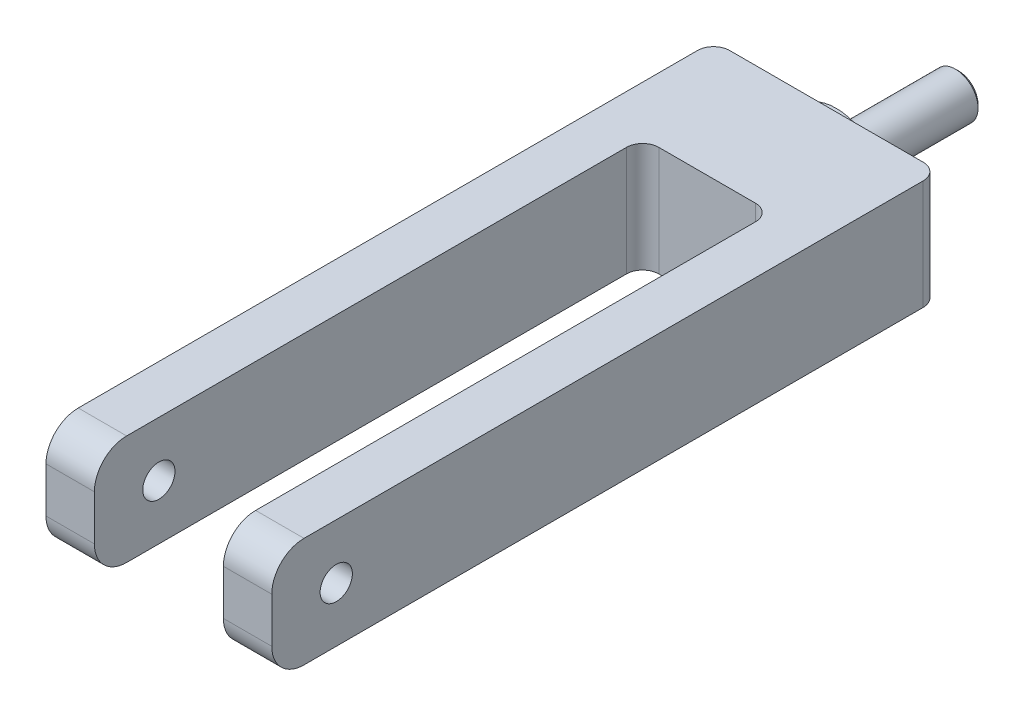
ISO-10303-21;
HEADER;
FILE_DESCRIPTION(('STEP AP214'),'2;1');
FILE_NAME('part.step','',(''),(''),'','','');
FILE_SCHEMA(('AUTOMOTIVE_DESIGN { 1 0 10303 214 1 1 1 1 }'));
ENDSEC;
DATA;
#1=APPLICATION_CONTEXT('core data for automotive mechanical design processes');
#2=APPLICATION_PROTOCOL_DEFINITION('international standard','automotive_design',2000,#1);
#3=PRODUCT_CONTEXT('',#1,'mechanical');
#4=PRODUCT('Part','Part','',(#3));
#5=PRODUCT_RELATED_PRODUCT_CATEGORY('part','',(#4));
#6=PRODUCT_DEFINITION_FORMATION('','',#4);
#7=PRODUCT_DEFINITION_CONTEXT('part definition',#1,'design');
#8=PRODUCT_DEFINITION('design','',#6,#7);
#9=PRODUCT_DEFINITION_SHAPE('','',#8);
#10=(LENGTH_UNIT() NAMED_UNIT(*) SI_UNIT(.MILLI.,.METRE.));
#11=(NAMED_UNIT(*) PLANE_ANGLE_UNIT() SI_UNIT($,.RADIAN.));
#12=(NAMED_UNIT(*) SI_UNIT($,.STERADIAN.) SOLID_ANGLE_UNIT());
#13=UNCERTAINTY_MEASURE_WITH_UNIT(LENGTH_MEASURE(1.E-05),#10,'distance_accuracy_value','');
#14=(GEOMETRIC_REPRESENTATION_CONTEXT(3) GLOBAL_UNCERTAINTY_ASSIGNED_CONTEXT((#13)) GLOBAL_UNIT_ASSIGNED_CONTEXT((#10,
#11,#12)) REPRESENTATION_CONTEXT('',''));
#15=CARTESIAN_POINT('',(0.,0.,0.));
#16=DIRECTION('',(0.,0.,1.));
#17=DIRECTION('',(1.,0.,0.));
#18=AXIS2_PLACEMENT_3D('',#15,#16,#17);
#19=CARTESIAN_POINT('',(0.,0.,-122.906328320802));
#20=DIRECTION('',(0.,0.,-1.));
#21=DIRECTION('',(-1.,0.,0.));
#22=AXIS2_PLACEMENT_3D('',#19,#20,#21);
#23=PLANE('',#22);
#24=CARTESIAN_POINT('',(0.,0.,-122.906328320802));
#25=DIRECTION('',(0.,0.,-1.));
#26=DIRECTION('',(-1.,0.,0.));
#27=AXIS2_PLACEMENT_3D('',#24,#25,#26);
#28=CIRCLE('',#27,15.);
#29=CARTESIAN_POINT('',(-15.,0.,-122.906328320802));
#30=VERTEX_POINT('',#29);
#31=EDGE_CURVE('E393',#30,#30,#28,.T.);
#32=ORIENTED_EDGE('',*,*,#31,.T.);
#33=EDGE_LOOP('',(#32));
#34=FACE_BOUND('',#33,.T.);
#35=CARTESIAN_POINT('',(0.,0.,-122.906328320802));
#36=DIRECTION('',(0.,0.,-1.));
#37=DIRECTION('',(-1.,0.,0.));
#38=AXIS2_PLACEMENT_3D('',#35,#36,#37);
#39=CIRCLE('',#38,7.);
#40=CARTESIAN_POINT('',(-7.00000000000002,0.,-122.906328320802));
#41=VERTEX_POINT('',#40);
#42=EDGE_CURVE('E250',#41,#41,#39,.T.);
#43=ORIENTED_EDGE('',*,*,#42,.F.);
#44=EDGE_LOOP('',(#43));
#45=FACE_BOUND('',#44,.T.);
#46=ADVANCED_FACE('F43',(#34,#45),#23,.T.);
#47=CARTESIAN_POINT('',(-35.,17.,-119.906328320802));
#48=DIRECTION('',(0.,0.,1.));
#49=DIRECTION('',(1.,0.,0.));
#50=AXIS2_PLACEMENT_3D('',#47,#48,#49);
#51=PLANE('',#50);
#52=DIRECTION('',(-1.,0.,0.));
#53=VECTOR('',#52,1.);
#54=CARTESIAN_POINT('',(-35.,17.,-119.906328320802));
#55=LINE('',#54,#53);
#56=CARTESIAN_POINT('',(30.,17.,-119.906328320802));
#57=VERTEX_POINT('',#56);
#58=CARTESIAN_POINT('',(-30.,17.,-119.906328320802));
#59=VERTEX_POINT('',#58);
#60=EDGE_CURVE('E203',#57,#59,#55,.T.);
#61=ORIENTED_EDGE('',*,*,#60,.F.);
#62=DIRECTION('',(0.,-1.,0.));
#63=VECTOR('',#62,1.);
#64=CARTESIAN_POINT('',(30.,17.,-119.906328320802));
#65=LINE('',#64,#63);
#66=CARTESIAN_POINT('',(30.,-17.,-119.906328320802));
#67=VERTEX_POINT('',#66);
#68=EDGE_CURVE('E219',#57,#67,#65,.T.);
#69=ORIENTED_EDGE('',*,*,#68,.T.);
#70=DIRECTION('',(-1.,0.,0.));
#71=VECTOR('',#70,1.);
#72=CARTESIAN_POINT('',(-35.,-17.,-119.906328320802));
#73=LINE('',#72,#71);
#74=CARTESIAN_POINT('',(-30.,-17.,-119.906328320802));
#75=VERTEX_POINT('',#74);
#76=EDGE_CURVE('E190',#67,#75,#73,.T.);
#77=ORIENTED_EDGE('',*,*,#76,.T.);
#78=DIRECTION('',(0.,-1.,0.));
#79=VECTOR('',#78,1.);
#80=CARTESIAN_POINT('',(-30.,17.,-119.906328320802));
#81=LINE('',#80,#79);
#82=EDGE_CURVE('E217',#75,#59,#81,.F.);
#83=ORIENTED_EDGE('',*,*,#82,.T.);
#84=EDGE_LOOP('',(#61,#69,#77,#83));
#85=FACE_BOUND('',#84,.T.);
#86=CARTESIAN_POINT('',(0.,0.,-119.906328320802));
#87=DIRECTION('',(0.,0.,1.));
#88=DIRECTION('',(1.,0.,0.));
#89=AXIS2_PLACEMENT_3D('',#86,#87,#88);
#90=CIRCLE('',#89,15.);
#91=CARTESIAN_POINT('',(15.,0.,-119.906328320802));
#92=VERTEX_POINT('',#91);
#93=EDGE_CURVE('E242',#92,#92,#90,.F.);
#94=ORIENTED_EDGE('',*,*,#93,.F.);
#95=EDGE_LOOP('',(#94));
#96=FACE_BOUND('',#95,.T.);
#97=ADVANCED_FACE('F296',(#85,#96),#51,.F.);
#98=CARTESIAN_POINT('',(-35.,17.,-119.906328320802));
#99=DIRECTION('',(1.,0.,0.));
#100=DIRECTION('',(0.,0.,-1.));
#101=AXIS2_PLACEMENT_3D('',#98,#99,#100);
#102=PLANE('',#101);
#103=CARTESIAN_POINT('',(-35.,0.,67.093671679198));
#104=DIRECTION('',(1.,0.,0.));
#105=DIRECTION('',(0.,0.,-1.));
#106=AXIS2_PLACEMENT_3D('',#103,#104,#105);
#107=CIRCLE('',#106,5.);
#108=CARTESIAN_POINT('',(-35.,0.,62.093671679198));
#109=VERTEX_POINT('',#108);
#110=EDGE_CURVE('E420',#109,#109,#107,.T.);
#111=ORIENTED_EDGE('',*,*,#110,.T.);
#112=EDGE_LOOP('',(#111));
#113=FACE_BOUND('',#112,.T.);
#114=DIRECTION('',(0.,0.,1.));
#115=VECTOR('',#114,1.);
#116=CARTESIAN_POINT('',(-35.,-17.,-119.906328320802));
#117=LINE('',#116,#115);
#118=CARTESIAN_POINT('',(-35.,-17.,-114.906328320802));
#119=VERTEX_POINT('',#118);
#120=CARTESIAN_POINT('',(-35.,-17.,77.093671679198));
#121=VERTEX_POINT('',#120);
#122=EDGE_CURVE('E391',#119,#121,#117,.T.);
#123=ORIENTED_EDGE('',*,*,#122,.T.);
#124=CARTESIAN_POINT('',(-35.,-7.,77.093671679198));
#125=DIRECTION('',(1.,0.,0.));
#126=DIRECTION('',(0.,0.,-1.));
#127=AXIS2_PLACEMENT_3D('',#124,#125,#126);
#128=CIRCLE('',#127,10.);
#129=CARTESIAN_POINT('',(-35.,-7.,87.093671679198));
#130=VERTEX_POINT('',#129);
#131=EDGE_CURVE('E275',#121,#130,#128,.F.);
#132=ORIENTED_EDGE('',*,*,#131,.T.);
#133=DIRECTION('',(0.,-1.,0.));
#134=VECTOR('',#133,1.);
#135=CARTESIAN_POINT('',(-35.,17.,87.093671679198));
#136=LINE('',#135,#134);
#137=CARTESIAN_POINT('',(-35.,7.,87.093671679198));
#138=VERTEX_POINT('',#137);
#139=EDGE_CURVE('E181',#138,#130,#136,.T.);
#140=ORIENTED_EDGE('',*,*,#139,.F.);
#141=CARTESIAN_POINT('',(-35.,7.,77.093671679198));
#142=DIRECTION('',(1.,0.,0.));
#143=DIRECTION('',(0.,0.,-1.));
#144=AXIS2_PLACEMENT_3D('',#141,#142,#143);
#145=CIRCLE('',#144,10.);
#146=CARTESIAN_POINT('',(-35.,17.,77.093671679198));
#147=VERTEX_POINT('',#146);
#148=EDGE_CURVE('E58',#138,#147,#145,.F.);
#149=ORIENTED_EDGE('',*,*,#148,.T.);
#150=DIRECTION('',(0.,0.,1.));
#151=VECTOR('',#150,1.);
#152=CARTESIAN_POINT('',(-35.,17.,-119.906328320802));
#153=LINE('',#152,#151);
#154=CARTESIAN_POINT('',(-35.,17.,-114.906328320802));
#155=VERTEX_POINT('',#154);
#156=EDGE_CURVE('E198',#155,#147,#153,.T.);
#157=ORIENTED_EDGE('',*,*,#156,.F.);
#158=DIRECTION('',(0.,-1.,0.));
#159=VECTOR('',#158,1.);
#160=CARTESIAN_POINT('',(-35.,17.,-114.906328320802));
#161=LINE('',#160,#159);
#162=EDGE_CURVE('E170',#155,#119,#161,.T.);
#163=ORIENTED_EDGE('',*,*,#162,.T.);
#164=EDGE_LOOP('',(#123,#132,#140,#149,#157,#163));
#165=FACE_BOUND('',#164,.T.);
#166=ADVANCED_FACE('F302',(#113,#165),#102,.F.);
#167=CARTESIAN_POINT('',(-35.,17.,87.093671679198));
#168=DIRECTION('',(0.,0.,-1.));
#169=DIRECTION('',(-1.,0.,0.));
#170=AXIS2_PLACEMENT_3D('',#167,#168,#169);
#171=PLANE('',#170);
#172=ORIENTED_EDGE('',*,*,#139,.T.);
#173=DIRECTION('',(1.,0.,0.));
#174=VECTOR('',#173,1.);
#175=CARTESIAN_POINT('',(-35.,-7.,87.093671679198));
#176=LINE('',#175,#174);
#177=CARTESIAN_POINT('',(-20.,-7.,87.093671679198));
#178=VERTEX_POINT('',#177);
#179=EDGE_CURVE('E268',#130,#178,#176,.T.);
#180=ORIENTED_EDGE('',*,*,#179,.T.);
#181=DIRECTION('',(0.,-1.,0.));
#182=VECTOR('',#181,1.);
#183=CARTESIAN_POINT('',(-20.,17.,87.093671679198));
#184=LINE('',#183,#182);
#185=CARTESIAN_POINT('',(-20.,7.,87.093671679198));
#186=VERTEX_POINT('',#185);
#187=EDGE_CURVE('E206',#186,#178,#184,.T.);
#188=ORIENTED_EDGE('',*,*,#187,.F.);
#189=DIRECTION('',(1.,0.,0.));
#190=VECTOR('',#189,1.);
#191=CARTESIAN_POINT('',(-35.,7.,87.093671679198));
#192=LINE('',#191,#190);
#193=EDGE_CURVE('E266',#186,#138,#192,.F.);
#194=ORIENTED_EDGE('',*,*,#193,.T.);
#195=EDGE_LOOP('',(#172,#180,#188,#194));
#196=FACE_BOUND('',#195,.T.);
#197=ADVANCED_FACE('F341',(#196),#171,.F.);
#198=CARTESIAN_POINT('',(-20.,17.,-82.906328320802));
#199=DIRECTION('',(-1.,0.,0.));
#200=DIRECTION('',(0.,0.,1.));
#201=AXIS2_PLACEMENT_3D('',#198,#199,#200);
#202=PLANE('',#201);
#203=CARTESIAN_POINT('',(-20.,0.,67.093671679198));
#204=DIRECTION('',(-1.,0.,0.));
#205=DIRECTION('',(0.,0.,1.));
#206=AXIS2_PLACEMENT_3D('',#203,#204,#205);
#207=CIRCLE('',#206,5.);
#208=CARTESIAN_POINT('',(-20.,0.,72.093671679198));
#209=VERTEX_POINT('',#208);
#210=EDGE_CURVE('E423',#209,#209,#207,.T.);
#211=ORIENTED_EDGE('',*,*,#210,.T.);
#212=EDGE_LOOP('',(#211));
#213=FACE_BOUND('',#212,.T.);
#214=ORIENTED_EDGE('',*,*,#187,.T.);
#215=CARTESIAN_POINT('',(-20.,-7.,77.093671679198));
#216=DIRECTION('',(-1.,0.,0.));
#217=DIRECTION('',(0.,0.,1.));
#218=AXIS2_PLACEMENT_3D('',#215,#216,#217);
#219=CIRCLE('',#218,10.);
#220=CARTESIAN_POINT('',(-20.,-17.,77.093671679198));
#221=VERTEX_POINT('',#220);
#222=EDGE_CURVE('E272',#178,#221,#219,.F.);
#223=ORIENTED_EDGE('',*,*,#222,.T.);
#224=DIRECTION('',(0.,0.,-1.));
#225=VECTOR('',#224,1.);
#226=CARTESIAN_POINT('',(-20.,-17.,-82.906328320802));
#227=LINE('',#226,#225);
#228=CARTESIAN_POINT('',(-20.,-17.,-77.906328320802));
#229=VERTEX_POINT('',#228);
#230=EDGE_CURVE('E192',#221,#229,#227,.T.);
#231=ORIENTED_EDGE('',*,*,#230,.T.);
#232=DIRECTION('',(0.,-1.,0.));
#233=VECTOR('',#232,1.);
#234=CARTESIAN_POINT('',(-20.,17.,-77.906328320802));
#235=LINE('',#234,#233);
#236=CARTESIAN_POINT('',(-20.,17.,-77.906328320802));
#237=VERTEX_POINT('',#236);
#238=EDGE_CURVE('E214',#229,#237,#235,.F.);
#239=ORIENTED_EDGE('',*,*,#238,.T.);
#240=DIRECTION('',(0.,0.,-1.));
#241=VECTOR('',#240,1.);
#242=CARTESIAN_POINT('',(-20.,17.,-82.906328320802));
#243=LINE('',#242,#241);
#244=CARTESIAN_POINT('',(-20.,17.,77.093671679198));
#245=VERTEX_POINT('',#244);
#246=EDGE_CURVE('E374',#245,#237,#243,.T.);
#247=ORIENTED_EDGE('',*,*,#246,.F.);
#248=CARTESIAN_POINT('',(-20.,7.,77.093671679198));
#249=DIRECTION('',(-1.,0.,0.));
#250=DIRECTION('',(0.,0.,1.));
#251=AXIS2_PLACEMENT_3D('',#248,#249,#250);
#252=CIRCLE('',#251,10.);
#253=EDGE_CURVE('E66',#245,#186,#252,.F.);
#254=ORIENTED_EDGE('',*,*,#253,.T.);
#255=EDGE_LOOP('',(#214,#223,#231,#239,#247,#254));
#256=FACE_BOUND('',#255,.T.);
#257=ADVANCED_FACE('F337',(#213,#256),#202,.F.);
#258=CARTESIAN_POINT('',(-20.,17.,-82.906328320802));
#259=DIRECTION('',(0.,0.,-1.));
#260=DIRECTION('',(-1.,0.,0.));
#261=AXIS2_PLACEMENT_3D('',#258,#259,#260);
#262=PLANE('',#261);
#263=DIRECTION('',(1.,0.,0.));
#264=VECTOR('',#263,1.);
#265=CARTESIAN_POINT('',(-20.,-17.,-82.906328320802));
#266=LINE('',#265,#264);
#267=CARTESIAN_POINT('',(-15.,-17.,-82.906328320802));
#268=VERTEX_POINT('',#267);
#269=CARTESIAN_POINT('',(15.,-17.,-82.906328320802));
#270=VERTEX_POINT('',#269);
#271=EDGE_CURVE('E188',#268,#270,#266,.T.);
#272=ORIENTED_EDGE('',*,*,#271,.T.);
#273=DIRECTION('',(0.,-1.,0.));
#274=VECTOR('',#273,1.);
#275=CARTESIAN_POINT('',(15.,17.,-82.906328320802));
#276=LINE('',#275,#274);
#277=CARTESIAN_POINT('',(15.,17.,-82.906328320802));
#278=VERTEX_POINT('',#277);
#279=EDGE_CURVE('E164',#270,#278,#276,.F.);
#280=ORIENTED_EDGE('',*,*,#279,.T.);
#281=DIRECTION('',(1.,0.,0.));
#282=VECTOR('',#281,1.);
#283=CARTESIAN_POINT('',(-20.,17.,-82.906328320802));
#284=LINE('',#283,#282);
#285=CARTESIAN_POINT('',(-15.,17.,-82.906328320802));
#286=VERTEX_POINT('',#285);
#287=EDGE_CURVE('E379',#286,#278,#284,.T.);
#288=ORIENTED_EDGE('',*,*,#287,.F.);
#289=DIRECTION('',(0.,-1.,0.));
#290=VECTOR('',#289,1.);
#291=CARTESIAN_POINT('',(-15.,-17.,-82.906328320802));
#292=LINE('',#291,#290);
#293=EDGE_CURVE('E180',#286,#268,#292,.T.);
#294=ORIENTED_EDGE('',*,*,#293,.T.);
#295=EDGE_LOOP('',(#272,#280,#288,#294));
#296=FACE_BOUND('',#295,.T.);
#297=ADVANCED_FACE('F333',(#296),#262,.F.);
#298=CARTESIAN_POINT('',(20.,17.,-82.906328320802));
#299=DIRECTION('',(1.,0.,0.));
#300=DIRECTION('',(0.,0.,-1.));
#301=AXIS2_PLACEMENT_3D('',#298,#299,#300);
#302=PLANE('',#301);
#303=CARTESIAN_POINT('',(20.,0.,67.093671679198));
#304=DIRECTION('',(1.,0.,0.));
#305=DIRECTION('',(0.,0.,-1.));
#306=AXIS2_PLACEMENT_3D('',#303,#304,#305);
#307=CIRCLE('',#306,5.);
#308=CARTESIAN_POINT('',(20.,0.,62.093671679198));
#309=VERTEX_POINT('',#308);
#310=EDGE_CURVE('E249',#309,#309,#307,.T.);
#311=ORIENTED_EDGE('',*,*,#310,.T.);
#312=EDGE_LOOP('',(#311));
#313=FACE_BOUND('',#312,.T.);
#314=DIRECTION('',(0.,0.,1.));
#315=VECTOR('',#314,1.);
#316=CARTESIAN_POINT('',(20.,-17.,-82.906328320802));
#317=LINE('',#316,#315);
#318=CARTESIAN_POINT('',(20.,-17.,-77.906328320802));
#319=VERTEX_POINT('',#318);
#320=CARTESIAN_POINT('',(20.,-17.,77.093671679198));
#321=VERTEX_POINT('',#320);
#322=EDGE_CURVE('E176',#319,#321,#317,.T.);
#323=ORIENTED_EDGE('',*,*,#322,.T.);
#324=CARTESIAN_POINT('',(20.,-7.,77.093671679198));
#325=DIRECTION('',(1.,0.,0.));
#326=DIRECTION('',(0.,0.,-1.));
#327=AXIS2_PLACEMENT_3D('',#324,#325,#326);
#328=CIRCLE('',#327,10.);
#329=CARTESIAN_POINT('',(20.,-7.,87.093671679198));
#330=VERTEX_POINT('',#329);
#331=EDGE_CURVE('E264',#321,#330,#328,.F.);
#332=ORIENTED_EDGE('',*,*,#331,.T.);
#333=DIRECTION('',(0.,-1.,0.));
#334=VECTOR('',#333,1.);
#335=CARTESIAN_POINT('',(20.,17.,87.093671679198));
#336=LINE('',#335,#334);
#337=CARTESIAN_POINT('',(20.,7.,87.093671679198));
#338=VERTEX_POINT('',#337);
#339=EDGE_CURVE('E202',#338,#330,#336,.T.);
#340=ORIENTED_EDGE('',*,*,#339,.F.);
#341=CARTESIAN_POINT('',(20.,7.,77.093671679198));
#342=DIRECTION('',(1.,0.,0.));
#343=DIRECTION('',(0.,0.,-1.));
#344=AXIS2_PLACEMENT_3D('',#341,#342,#343);
#345=CIRCLE('',#344,10.);
#346=CARTESIAN_POINT('',(20.,17.,77.093671679198));
#347=VERTEX_POINT('',#346);
#348=EDGE_CURVE('E262',#338,#347,#345,.F.);
#349=ORIENTED_EDGE('',*,*,#348,.T.);
#350=DIRECTION('',(0.,0.,1.));
#351=VECTOR('',#350,1.);
#352=CARTESIAN_POINT('',(20.,17.,-82.906328320802));
#353=LINE('',#352,#351);
#354=CARTESIAN_POINT('',(20.,17.,-77.906328320802));
#355=VERTEX_POINT('',#354);
#356=EDGE_CURVE('E179',#355,#347,#353,.T.);
#357=ORIENTED_EDGE('',*,*,#356,.F.);
#358=DIRECTION('',(0.,-1.,0.));
#359=VECTOR('',#358,1.);
#360=CARTESIAN_POINT('',(20.,-17.,-77.906328320802));
#361=LINE('',#360,#359);
#362=EDGE_CURVE('E163',#355,#319,#361,.T.);
#363=ORIENTED_EDGE('',*,*,#362,.T.);
#364=EDGE_LOOP('',(#323,#332,#340,#349,#357,#363));
#365=FACE_BOUND('',#364,.T.);
#366=ADVANCED_FACE('F175',(#313,#365),#302,.F.);
#367=CARTESIAN_POINT('',(20.,17.,87.093671679198));
#368=DIRECTION('',(0.,0.,-1.));
#369=DIRECTION('',(-1.,0.,0.));
#370=AXIS2_PLACEMENT_3D('',#367,#368,#369);
#371=PLANE('',#370);
#372=ORIENTED_EDGE('',*,*,#339,.T.);
#373=DIRECTION('',(1.,0.,0.));
#374=VECTOR('',#373,1.);
#375=CARTESIAN_POINT('',(20.,-7.,87.093671679198));
#376=LINE('',#375,#374);
#377=CARTESIAN_POINT('',(35.,-7.,87.093671679198));
#378=VERTEX_POINT('',#377);
#379=EDGE_CURVE('E252',#330,#378,#376,.T.);
#380=ORIENTED_EDGE('',*,*,#379,.T.);
#381=DIRECTION('',(0.,-1.,0.));
#382=VECTOR('',#381,1.);
#383=CARTESIAN_POINT('',(35.,17.,87.093671679198));
#384=LINE('',#383,#382);
#385=CARTESIAN_POINT('',(35.,7.,87.093671679198));
#386=VERTEX_POINT('',#385);
#387=EDGE_CURVE('E199',#386,#378,#384,.T.);
#388=ORIENTED_EDGE('',*,*,#387,.F.);
#389=DIRECTION('',(1.,0.,0.));
#390=VECTOR('',#389,1.);
#391=CARTESIAN_POINT('',(20.,7.,87.093671679198));
#392=LINE('',#391,#390);
#393=EDGE_CURVE('E245',#386,#338,#392,.F.);
#394=ORIENTED_EDGE('',*,*,#393,.T.);
#395=EDGE_LOOP('',(#372,#380,#388,#394));
#396=FACE_BOUND('',#395,.T.);
#397=ADVANCED_FACE('F326',(#396),#371,.F.);
#398=CARTESIAN_POINT('',(35.,17.,-119.906328320802));
#399=DIRECTION('',(-1.,0.,0.));
#400=DIRECTION('',(0.,0.,1.));
#401=AXIS2_PLACEMENT_3D('',#398,#399,#400);
#402=PLANE('',#401);
#403=CARTESIAN_POINT('',(35.,0.,67.093671679198));
#404=DIRECTION('',(-1.,0.,0.));
#405=DIRECTION('',(0.,0.,1.));
#406=AXIS2_PLACEMENT_3D('',#403,#404,#405);
#407=CIRCLE('',#406,5.);
#408=CARTESIAN_POINT('',(35.,0.,72.093671679198));
#409=VERTEX_POINT('',#408);
#410=EDGE_CURVE('E246',#409,#409,#407,.T.);
#411=ORIENTED_EDGE('',*,*,#410,.T.);
#412=EDGE_LOOP('',(#411));
#413=FACE_BOUND('',#412,.T.);
#414=ORIENTED_EDGE('',*,*,#387,.T.);
#415=CARTESIAN_POINT('',(35.,-7.,77.093671679198));
#416=DIRECTION('',(-1.,0.,0.));
#417=DIRECTION('',(0.,0.,1.));
#418=AXIS2_PLACEMENT_3D('',#415,#416,#417);
#419=CIRCLE('',#418,10.);
#420=CARTESIAN_POINT('',(35.,-17.,77.093671679198));
#421=VERTEX_POINT('',#420);
#422=EDGE_CURVE('E257',#378,#421,#419,.F.);
#423=ORIENTED_EDGE('',*,*,#422,.T.);
#424=DIRECTION('',(0.,0.,-1.));
#425=VECTOR('',#424,1.);
#426=CARTESIAN_POINT('',(35.,-17.,-119.906328320802));
#427=LINE('',#426,#425);
#428=CARTESIAN_POINT('',(35.,-17.,-114.906328320802));
#429=VERTEX_POINT('',#428);
#430=EDGE_CURVE('E187',#421,#429,#427,.T.);
#431=ORIENTED_EDGE('',*,*,#430,.T.);
#432=DIRECTION('',(0.,-1.,0.));
#433=VECTOR('',#432,1.);
#434=CARTESIAN_POINT('',(35.,17.,-114.906328320802));
#435=LINE('',#434,#433);
#436=CARTESIAN_POINT('',(35.,17.,-114.906328320802));
#437=VERTEX_POINT('',#436);
#438=EDGE_CURVE('E227',#429,#437,#435,.F.);
#439=ORIENTED_EDGE('',*,*,#438,.T.);
#440=DIRECTION('',(0.,0.,-1.));
#441=VECTOR('',#440,1.);
#442=CARTESIAN_POINT('',(35.,17.,-119.906328320802));
#443=LINE('',#442,#441);
#444=CARTESIAN_POINT('',(35.,17.,77.093671679198));
#445=VERTEX_POINT('',#444);
#446=EDGE_CURVE('E387',#445,#437,#443,.T.);
#447=ORIENTED_EDGE('',*,*,#446,.F.);
#448=CARTESIAN_POINT('',(35.,7.,77.093671679198));
#449=DIRECTION('',(-1.,0.,0.));
#450=DIRECTION('',(0.,0.,1.));
#451=AXIS2_PLACEMENT_3D('',#448,#449,#450);
#452=CIRCLE('',#451,10.);
#453=EDGE_CURVE('E255',#445,#386,#452,.F.);
#454=ORIENTED_EDGE('',*,*,#453,.T.);
#455=EDGE_LOOP('',(#414,#423,#431,#439,#447,#454));
#456=FACE_BOUND('',#455,.T.);
#457=ADVANCED_FACE('F320',(#413,#456),#402,.F.);
#458=CARTESIAN_POINT('',(-35.,17.,87.093671679198));
#459=DIRECTION('',(0.,1.,0.));
#460=DIRECTION('',(0.,0.,1.));
#461=AXIS2_PLACEMENT_3D('',#458,#459,#460);
#462=PLANE('',#461);
#463=ORIENTED_EDGE('',*,*,#156,.T.);
#464=DIRECTION('',(1.,0.,0.));
#465=VECTOR('',#464,1.);
#466=CARTESIAN_POINT('',(-20.,17.,77.093671679198));
#467=LINE('',#466,#465);
#468=EDGE_CURVE('E280',#147,#245,#467,.T.);
#469=ORIENTED_EDGE('',*,*,#468,.T.);
#470=ORIENTED_EDGE('',*,*,#246,.T.);
#471=CARTESIAN_POINT('',(-15.,17.,-77.906328320802));
#472=DIRECTION('',(0.,1.,0.));
#473=DIRECTION('',(0.,0.,1.));
#474=AXIS2_PLACEMENT_3D('',#471,#472,#473);
#475=CIRCLE('',#474,5.);
#476=EDGE_CURVE('E240',#237,#286,#475,.F.);
#477=ORIENTED_EDGE('',*,*,#476,.T.);
#478=ORIENTED_EDGE('',*,*,#287,.T.);
#479=CARTESIAN_POINT('',(15.,17.,-77.906328320802));
#480=DIRECTION('',(0.,1.,0.));
#481=DIRECTION('',(0.,0.,1.));
#482=AXIS2_PLACEMENT_3D('',#479,#480,#481);
#483=CIRCLE('',#482,5.);
#484=EDGE_CURVE('E169',#278,#355,#483,.F.);
#485=ORIENTED_EDGE('',*,*,#484,.T.);
#486=ORIENTED_EDGE('',*,*,#356,.T.);
#487=DIRECTION('',(1.,0.,0.));
#488=VECTOR('',#487,1.);
#489=CARTESIAN_POINT('',(35.,17.,77.093671679198));
#490=LINE('',#489,#488);
#491=EDGE_CURVE('E277',#347,#445,#490,.T.);
#492=ORIENTED_EDGE('',*,*,#491,.T.);
#493=ORIENTED_EDGE('',*,*,#446,.T.);
#494=CARTESIAN_POINT('',(30.,17.,-114.906328320802));
#495=DIRECTION('',(0.,1.,0.));
#496=DIRECTION('',(0.,0.,1.));
#497=AXIS2_PLACEMENT_3D('',#494,#495,#496);
#498=CIRCLE('',#497,5.);
#499=EDGE_CURVE('E232',#437,#57,#498,.T.);
#500=ORIENTED_EDGE('',*,*,#499,.T.);
#501=ORIENTED_EDGE('',*,*,#60,.T.);
#502=CARTESIAN_POINT('',(-30.,17.,-114.906328320802));
#503=DIRECTION('',(0.,1.,0.));
#504=DIRECTION('',(0.,0.,1.));
#505=AXIS2_PLACEMENT_3D('',#502,#503,#504);
#506=CIRCLE('',#505,5.);
#507=EDGE_CURVE('E230',#59,#155,#506,.T.);
#508=ORIENTED_EDGE('',*,*,#507,.T.);
#509=EDGE_LOOP('',(#463,#469,#470,#477,#478,#485,#486,#492,#493,#500,#501,#508));
#510=FACE_BOUND('',#509,.T.);
#511=ADVANCED_FACE('F317',(#510),#462,.T.);
#512=CARTESIAN_POINT('',(-35.,-17.,87.093671679198));
#513=DIRECTION('',(0.,1.,0.));
#514=DIRECTION('',(0.,0.,1.));
#515=AXIS2_PLACEMENT_3D('',#512,#513,#514);
#516=PLANE('',#515);
#517=ORIENTED_EDGE('',*,*,#430,.F.);
#518=DIRECTION('',(1.,0.,0.));
#519=VECTOR('',#518,1.);
#520=CARTESIAN_POINT('',(-35.,-17.,77.0936716791981));
#521=LINE('',#520,#519);
#522=EDGE_CURVE('E186',#421,#321,#521,.F.);
#523=ORIENTED_EDGE('',*,*,#522,.T.);
#524=ORIENTED_EDGE('',*,*,#322,.F.);
#525=CARTESIAN_POINT('',(15.,-17.,-77.906328320802));
#526=DIRECTION('',(0.,1.,0.));
#527=DIRECTION('',(0.,0.,1.));
#528=AXIS2_PLACEMENT_3D('',#525,#526,#527);
#529=CIRCLE('',#528,5.);
#530=EDGE_CURVE('E159',#319,#270,#529,.T.);
#531=ORIENTED_EDGE('',*,*,#530,.T.);
#532=ORIENTED_EDGE('',*,*,#271,.F.);
#533=CARTESIAN_POINT('',(-15.,-17.,-77.906328320802));
#534=DIRECTION('',(0.,1.,0.));
#535=DIRECTION('',(0.,0.,1.));
#536=AXIS2_PLACEMENT_3D('',#533,#534,#535);
#537=CIRCLE('',#536,5.);
#538=EDGE_CURVE('E237',#268,#229,#537,.T.);
#539=ORIENTED_EDGE('',*,*,#538,.T.);
#540=ORIENTED_EDGE('',*,*,#230,.F.);
#541=DIRECTION('',(1.,0.,0.));
#542=VECTOR('',#541,1.);
#543=CARTESIAN_POINT('',(-35.,-17.,77.093671679198));
#544=LINE('',#543,#542);
#545=EDGE_CURVE('E259',#221,#121,#544,.F.);
#546=ORIENTED_EDGE('',*,*,#545,.T.);
#547=ORIENTED_EDGE('',*,*,#122,.F.);
#548=CARTESIAN_POINT('',(-30.,-17.,-114.906328320802));
#549=DIRECTION('',(0.,1.,0.));
#550=DIRECTION('',(0.,0.,1.));
#551=AXIS2_PLACEMENT_3D('',#548,#549,#550);
#552=CIRCLE('',#551,5.);
#553=EDGE_CURVE('E222',#119,#75,#552,.F.);
#554=ORIENTED_EDGE('',*,*,#553,.T.);
#555=ORIENTED_EDGE('',*,*,#76,.F.);
#556=CARTESIAN_POINT('',(30.,-17.,-114.906328320802));
#557=DIRECTION('',(0.,1.,0.));
#558=DIRECTION('',(0.,0.,1.));
#559=AXIS2_PLACEMENT_3D('',#556,#557,#558);
#560=CIRCLE('',#559,5.);
#561=EDGE_CURVE('E224',#67,#429,#560,.F.);
#562=ORIENTED_EDGE('',*,*,#561,.T.);
#563=EDGE_LOOP('',(#517,#523,#524,#531,#532,#539,#540,#546,#547,#554,#555,#562));
#564=FACE_BOUND('',#563,.T.);
#565=ADVANCED_FACE('F184',(#564),#516,.F.);
#566=CARTESIAN_POINT('',(15.,17.,-77.906328320802));
#567=DIRECTION('',(0.,1.,0.));
#568=DIRECTION('',(0.,0.,1.));
#569=AXIS2_PLACEMENT_3D('',#566,#567,#568);
#570=CYLINDRICAL_SURFACE('',#569,5.);
#571=ORIENTED_EDGE('',*,*,#484,.F.);
#572=ORIENTED_EDGE('',*,*,#279,.F.);
#573=ORIENTED_EDGE('',*,*,#530,.F.);
#574=ORIENTED_EDGE('',*,*,#362,.F.);
#575=EDGE_LOOP('',(#571,#572,#573,#574));
#576=FACE_BOUND('',#575,.T.);
#577=ADVANCED_FACE('F162',(#576),#570,.F.);
#578=CARTESIAN_POINT('',(-15.,17.,-77.906328320802));
#579=DIRECTION('',(0.,1.,0.));
#580=DIRECTION('',(0.,0.,1.));
#581=AXIS2_PLACEMENT_3D('',#578,#579,#580);
#582=CYLINDRICAL_SURFACE('',#581,5.);
#583=ORIENTED_EDGE('',*,*,#476,.F.);
#584=ORIENTED_EDGE('',*,*,#238,.F.);
#585=ORIENTED_EDGE('',*,*,#538,.F.);
#586=ORIENTED_EDGE('',*,*,#293,.F.);
#587=EDGE_LOOP('',(#583,#584,#585,#586));
#588=FACE_BOUND('',#587,.T.);
#589=ADVANCED_FACE('F351',(#588),#582,.F.);
#590=CARTESIAN_POINT('',(30.,17.,-114.906328320802));
#591=DIRECTION('',(0.,-1.,0.));
#592=DIRECTION('',(0.,0.,-1.));
#593=AXIS2_PLACEMENT_3D('',#590,#591,#592);
#594=CYLINDRICAL_SURFACE('',#593,5.);
#595=ORIENTED_EDGE('',*,*,#499,.F.);
#596=ORIENTED_EDGE('',*,*,#438,.F.);
#597=ORIENTED_EDGE('',*,*,#561,.F.);
#598=ORIENTED_EDGE('',*,*,#68,.F.);
#599=EDGE_LOOP('',(#595,#596,#597,#598));
#600=FACE_BOUND('',#599,.T.);
#601=ADVANCED_FACE('F354',(#600),#594,.T.);
#602=CARTESIAN_POINT('',(-30.,17.,-114.906328320802));
#603=DIRECTION('',(0.,-1.,0.));
#604=DIRECTION('',(0.,0.,-1.));
#605=AXIS2_PLACEMENT_3D('',#602,#603,#604);
#606=CYLINDRICAL_SURFACE('',#605,5.);
#607=ORIENTED_EDGE('',*,*,#507,.F.);
#608=ORIENTED_EDGE('',*,*,#82,.F.);
#609=ORIENTED_EDGE('',*,*,#553,.F.);
#610=ORIENTED_EDGE('',*,*,#162,.F.);
#611=EDGE_LOOP('',(#607,#608,#609,#610));
#612=FACE_BOUND('',#611,.T.);
#613=ADVANCED_FACE('F315',(#612),#606,.T.);
#614=CARTESIAN_POINT('',(0.,0.,-122.906328320802));
#615=DIRECTION('',(0.,0.,1.));
#616=DIRECTION('',(1.,0.,0.));
#617=AXIS2_PLACEMENT_3D('',#614,#615,#616);
#618=CYLINDRICAL_SURFACE('',#617,15.);
#619=ORIENTED_EDGE('',*,*,#31,.F.);
#620=EDGE_LOOP('',(#619));
#621=FACE_BOUND('',#620,.T.);
#622=ORIENTED_EDGE('',*,*,#93,.T.);
#623=EDGE_LOOP('',(#622));
#624=FACE_BOUND('',#623,.T.);
#625=ADVANCED_FACE('F311',(#621,#624),#618,.T.);
#626=CARTESIAN_POINT('',(-56.,0.,67.093671679198));
#627=DIRECTION('',(1.,0.,0.));
#628=DIRECTION('',(0.,0.,-1.));
#629=AXIS2_PLACEMENT_3D('',#626,#627,#628);
#630=CYLINDRICAL_SURFACE('',#629,5.);
#631=ORIENTED_EDGE('',*,*,#410,.F.);
#632=EDGE_LOOP('',(#631));
#633=FACE_BOUND('',#632,.T.);
#634=ORIENTED_EDGE('',*,*,#310,.F.);
#635=EDGE_LOOP('',(#634));
#636=FACE_BOUND('',#635,.T.);
#637=ADVANCED_FACE('F314',(#633,#636),#630,.F.);
#638=ORIENTED_EDGE('',*,*,#210,.F.);
#639=EDGE_LOOP('',(#638));
#640=FACE_BOUND('',#639,.T.);
#641=ORIENTED_EDGE('',*,*,#110,.F.);
#642=EDGE_LOOP('',(#641));
#643=FACE_BOUND('',#642,.T.);
#644=ADVANCED_FACE('F309',(#640,#643),#630,.F.);
#645=CARTESIAN_POINT('',(0.,0.,-160.906328320802));
#646=DIRECTION('',(0.,0.,1.));
#647=DIRECTION('',(1.,0.,0.));
#648=AXIS2_PLACEMENT_3D('',#645,#646,#647);
#649=CYLINDRICAL_SURFACE('',#648,7.);
#650=CARTESIAN_POINT('',(0.,0.,-159.906328320802));
#651=DIRECTION('',(0.,0.,-1.));
#652=DIRECTION('',(-1.,0.,0.));
#653=AXIS2_PLACEMENT_3D('',#650,#651,#652);
#654=CIRCLE('',#653,7.);
#655=CARTESIAN_POINT('',(-7.00000000000003,0.,-159.906328320802));
#656=VERTEX_POINT('',#655);
#657=EDGE_CURVE('E11',#656,#656,#654,.F.);
#658=ORIENTED_EDGE('',*,*,#657,.T.);
#659=EDGE_LOOP('',(#658));
#660=FACE_BOUND('',#659,.T.);
#661=ORIENTED_EDGE('',*,*,#42,.T.);
#662=EDGE_LOOP('',(#661));
#663=FACE_BOUND('',#662,.T.);
#664=ADVANCED_FACE('F433',(#660,#663),#649,.T.);
#665=CARTESIAN_POINT('',(0.,0.,-160.906328320802));
#666=DIRECTION('',(0.,0.,-1.));
#667=DIRECTION('',(-1.,0.,0.));
#668=AXIS2_PLACEMENT_3D('',#665,#666,#667);
#669=PLANE('',#668);
#670=CARTESIAN_POINT('',(0.,0.,-160.906328320802));
#671=DIRECTION('',(0.,0.,-1.));
#672=DIRECTION('',(-1.,0.,0.));
#673=AXIS2_PLACEMENT_3D('',#670,#671,#672);
#674=CIRCLE('',#673,6.);
#675=CARTESIAN_POINT('',(-6.00000000000004,0.,-160.906328320802));
#676=VERTEX_POINT('',#675);
#677=EDGE_CURVE('E51',#676,#676,#674,.T.);
#678=ORIENTED_EDGE('',*,*,#677,.T.);
#679=EDGE_LOOP('',(#678));
#680=FACE_BOUND('',#679,.T.);
#681=ADVANCED_FACE('F284',(#680),#669,.T.);
#682=CARTESIAN_POINT('',(20.,-7.,77.093671679198));
#683=DIRECTION('',(1.,0.,0.));
#684=DIRECTION('',(0.,0.,-1.));
#685=AXIS2_PLACEMENT_3D('',#682,#683,#684);
#686=CYLINDRICAL_SURFACE('',#685,10.);
#687=ORIENTED_EDGE('',*,*,#331,.F.);
#688=ORIENTED_EDGE('',*,*,#522,.F.);
#689=ORIENTED_EDGE('',*,*,#422,.F.);
#690=ORIENTED_EDGE('',*,*,#379,.F.);
#691=EDGE_LOOP('',(#687,#688,#689,#690));
#692=FACE_BOUND('',#691,.T.);
#693=ADVANCED_FACE('F362',(#692),#686,.T.);
#694=CARTESIAN_POINT('',(-35.,-7.,77.093671679198));
#695=DIRECTION('',(1.,0.,0.));
#696=DIRECTION('',(0.,0.,-1.));
#697=AXIS2_PLACEMENT_3D('',#694,#695,#696);
#698=CYLINDRICAL_SURFACE('',#697,10.);
#699=ORIENTED_EDGE('',*,*,#131,.F.);
#700=ORIENTED_EDGE('',*,*,#545,.F.);
#701=ORIENTED_EDGE('',*,*,#222,.F.);
#702=ORIENTED_EDGE('',*,*,#179,.F.);
#703=EDGE_LOOP('',(#699,#700,#701,#702));
#704=FACE_BOUND('',#703,.T.);
#705=ADVANCED_FACE('F365',(#704),#698,.T.);
#706=CARTESIAN_POINT('',(-35.,7.,77.093671679198));
#707=DIRECTION('',(-1.,0.,0.));
#708=DIRECTION('',(0.,0.,1.));
#709=AXIS2_PLACEMENT_3D('',#706,#707,#708);
#710=CYLINDRICAL_SURFACE('',#709,10.);
#711=ORIENTED_EDGE('',*,*,#148,.F.);
#712=ORIENTED_EDGE('',*,*,#193,.F.);
#713=ORIENTED_EDGE('',*,*,#253,.F.);
#714=ORIENTED_EDGE('',*,*,#468,.F.);
#715=EDGE_LOOP('',(#711,#712,#713,#714));
#716=FACE_BOUND('',#715,.T.);
#717=ADVANCED_FACE('F292',(#716),#710,.T.);
#718=CARTESIAN_POINT('',(-35.,7.,77.0936716791981));
#719=DIRECTION('',(-1.,0.,0.));
#720=DIRECTION('',(0.,0.,1.));
#721=AXIS2_PLACEMENT_3D('',#718,#719,#720);
#722=CYLINDRICAL_SURFACE('',#721,10.);
#723=ORIENTED_EDGE('',*,*,#348,.F.);
#724=ORIENTED_EDGE('',*,*,#393,.F.);
#725=ORIENTED_EDGE('',*,*,#453,.F.);
#726=ORIENTED_EDGE('',*,*,#491,.F.);
#727=EDGE_LOOP('',(#723,#724,#725,#726));
#728=FACE_BOUND('',#727,.T.);
#729=ADVANCED_FACE('F287',(#728),#722,.T.);
#730=CARTESIAN_POINT('',(0.,0.,-160.906328320802));
#731=DIRECTION('',(0.,0.,1.));
#732=DIRECTION('',(1.,0.,0.));
#733=AXIS2_PLACEMENT_3D('',#730,#731,#732);
#734=CONICAL_SURFACE('',#733,6.,0.785398163397446);
#735=ORIENTED_EDGE('',*,*,#657,.F.);
#736=EDGE_LOOP('',(#735));
#737=FACE_BOUND('',#736,.T.);
#738=ORIENTED_EDGE('',*,*,#677,.F.);
#739=EDGE_LOOP('',(#738));
#740=FACE_BOUND('',#739,.T.);
#741=ADVANCED_FACE('F45',(#737,#740),#734,.T.);
#742=CLOSED_SHELL('',(#46,#97,#166,#197,#257,#297,#366,#397,#457,#511,#565,#577,#589,#601,#613,
#625,#637,#644,#664,#681,#693,#705,#717,#729,#741));
#743=MANIFOLD_SOLID_BREP('B2',#742);
#744=ADVANCED_BREP_SHAPE_REPRESENTATION('',(#18,#743),#14);
#745=SHAPE_DEFINITION_REPRESENTATION(#9,#744);
ENDSEC;
END-ISO-10303-21;
